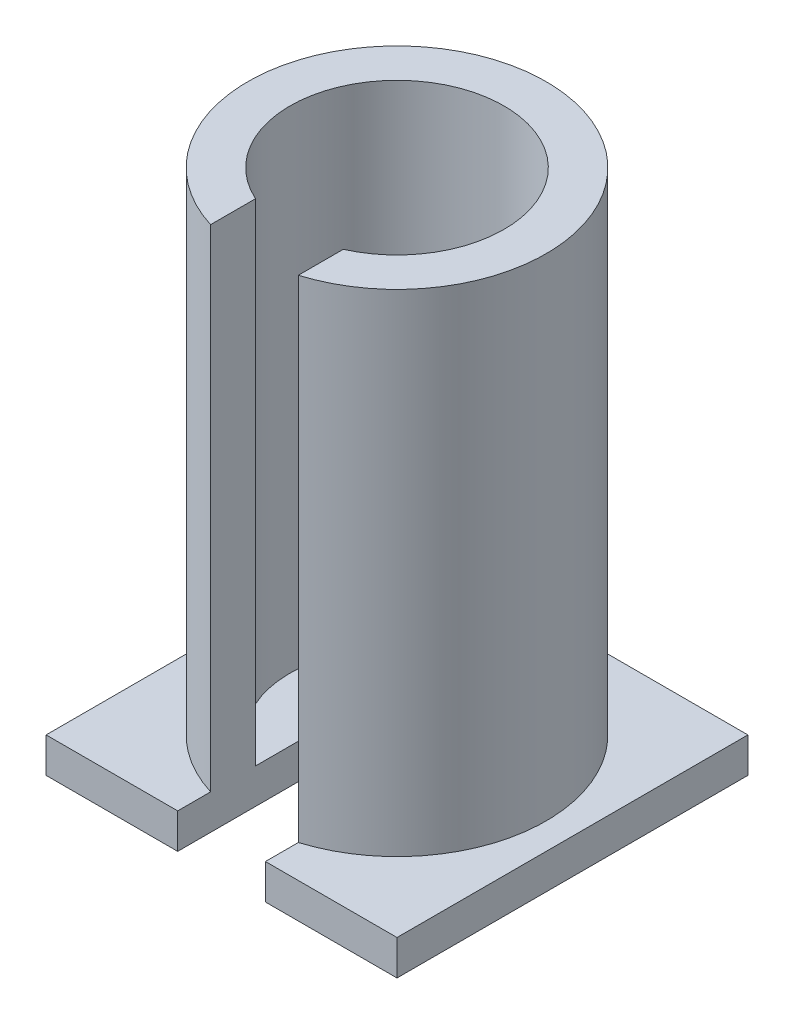
ISO-10303-21;
HEADER;
FILE_DESCRIPTION(('STEP AP214'),'2;1');
FILE_NAME('part.step','',(''),(''),'','','');
FILE_SCHEMA(('AUTOMOTIVE_DESIGN { 1 0 10303 214 1 1 1 1 }'));
ENDSEC;
DATA;
#1=APPLICATION_CONTEXT('core data for automotive mechanical design processes');
#2=APPLICATION_PROTOCOL_DEFINITION('international standard','automotive_design',2000,#1);
#3=PRODUCT_CONTEXT('',#1,'mechanical');
#4=PRODUCT('Part','Part','',(#3));
#5=PRODUCT_RELATED_PRODUCT_CATEGORY('part','',(#4));
#6=PRODUCT_DEFINITION_FORMATION('','',#4);
#7=PRODUCT_DEFINITION_CONTEXT('part definition',#1,'design');
#8=PRODUCT_DEFINITION('design','',#6,#7);
#9=PRODUCT_DEFINITION_SHAPE('','',#8);
#10=(LENGTH_UNIT() NAMED_UNIT(*) SI_UNIT(.MILLI.,.METRE.));
#11=(NAMED_UNIT(*) PLANE_ANGLE_UNIT() SI_UNIT($,.RADIAN.));
#12=(NAMED_UNIT(*) SI_UNIT($,.STERADIAN.) SOLID_ANGLE_UNIT());
#13=UNCERTAINTY_MEASURE_WITH_UNIT(LENGTH_MEASURE(1.E-05),#10,'distance_accuracy_value','');
#14=(GEOMETRIC_REPRESENTATION_CONTEXT(3) GLOBAL_UNCERTAINTY_ASSIGNED_CONTEXT((#13)) GLOBAL_UNIT_ASSIGNED_CONTEXT((#10,
#11,#12)) REPRESENTATION_CONTEXT('',''));
#15=CARTESIAN_POINT('',(0.,0.,0.));
#16=DIRECTION('',(0.,0.,1.));
#17=DIRECTION('',(1.,0.,0.));
#18=AXIS2_PLACEMENT_3D('',#15,#16,#17);
#19=CARTESIAN_POINT('',(0.,15.,0.));
#20=DIRECTION('',(0.,-1.,0.));
#21=DIRECTION('',(0.,0.,-1.));
#22=AXIS2_PLACEMENT_3D('',#19,#20,#21);
#23=CYLINDRICAL_SURFACE('',#22,4.25);
#24=DIRECTION('',(0.,-1.,0.));
#25=VECTOR('',#24,1.);
#26=CARTESIAN_POINT('',(1.25,15.,4.06201920231798));
#27=LINE('',#26,#25);
#28=CARTESIAN_POINT('',(1.25,15.,4.06201920231798));
#29=VERTEX_POINT('',#28);
#30=CARTESIAN_POINT('',(1.25,1.,4.06201920231798));
#31=VERTEX_POINT('',#30);
#32=EDGE_CURVE('E54',#29,#31,#27,.T.);
#33=ORIENTED_EDGE('',*,*,#32,.T.);
#34=CARTESIAN_POINT('',(0.,1.,0.));
#35=DIRECTION('',(0.,1.,0.));
#36=DIRECTION('',(0.,0.,1.));
#37=AXIS2_PLACEMENT_3D('',#34,#35,#36);
#38=CIRCLE('',#37,4.25);
#39=CARTESIAN_POINT('',(-1.25,1.,4.06201920231798));
#40=VERTEX_POINT('',#39);
#41=EDGE_CURVE('E58',#31,#40,#38,.T.);
#42=ORIENTED_EDGE('',*,*,#41,.T.);
#43=DIRECTION('',(0.,-1.,0.));
#44=VECTOR('',#43,1.);
#45=CARTESIAN_POINT('',(-1.25,15.,4.06201920231798));
#46=LINE('',#45,#44);
#47=CARTESIAN_POINT('',(-1.25,15.,4.06201920231798));
#48=VERTEX_POINT('',#47);
#49=EDGE_CURVE('E234',#48,#40,#46,.T.);
#50=ORIENTED_EDGE('',*,*,#49,.F.);
#51=CARTESIAN_POINT('',(0.,15.,0.));
#52=DIRECTION('',(0.,1.,0.));
#53=DIRECTION('',(0.,0.,1.));
#54=AXIS2_PLACEMENT_3D('',#51,#52,#53);
#55=CIRCLE('',#54,4.25);
#56=EDGE_CURVE('E242',#29,#48,#55,.T.);
#57=ORIENTED_EDGE('',*,*,#56,.F.);
#58=EDGE_LOOP('',(#33,#42,#50,#57));
#59=FACE_BOUND('',#58,.T.);
#60=ADVANCED_FACE('F39',(#59),#23,.T.);
#61=CARTESIAN_POINT('',(0.,15.,0.));
#62=DIRECTION('',(0.,-1.,0.));
#63=DIRECTION('',(0.,0.,-1.));
#64=AXIS2_PLACEMENT_3D('',#61,#62,#63);
#65=CYLINDRICAL_SURFACE('',#64,3.05);
#66=CARTESIAN_POINT('',(0.,15.,0.));
#67=DIRECTION('',(0.,1.,0.));
#68=DIRECTION('',(0.,0.,1.));
#69=AXIS2_PLACEMENT_3D('',#66,#67,#68);
#70=CIRCLE('',#69,3.05);
#71=CARTESIAN_POINT('',(1.25,15.,2.78208554864871));
#72=VERTEX_POINT('',#71);
#73=CARTESIAN_POINT('',(-1.25,15.,2.78208554864871));
#74=VERTEX_POINT('',#73);
#75=EDGE_CURVE('E249',#72,#74,#70,.T.);
#76=ORIENTED_EDGE('',*,*,#75,.T.);
#77=DIRECTION('',(0.,-1.,0.));
#78=VECTOR('',#77,1.);
#79=CARTESIAN_POINT('',(-1.25,15.,2.78208554864871));
#80=LINE('',#79,#78);
#81=CARTESIAN_POINT('',(-1.25,1.,2.78208554864871));
#82=VERTEX_POINT('',#81);
#83=EDGE_CURVE('E230',#74,#82,#80,.T.);
#84=ORIENTED_EDGE('',*,*,#83,.T.);
#85=CARTESIAN_POINT('',(0.,1.,0.));
#86=DIRECTION('',(0.,1.,0.));
#87=DIRECTION('',(0.,0.,1.));
#88=AXIS2_PLACEMENT_3D('',#85,#86,#87);
#89=CIRCLE('',#88,3.05);
#90=CARTESIAN_POINT('',(1.25,1.,2.78208554864871));
#91=VERTEX_POINT('',#90);
#92=EDGE_CURVE('E253',#91,#82,#89,.T.);
#93=ORIENTED_EDGE('',*,*,#92,.F.);
#94=DIRECTION('',(0.,-1.,0.));
#95=VECTOR('',#94,1.);
#96=CARTESIAN_POINT('',(1.25,15.,2.78208554864871));
#97=LINE('',#96,#95);
#98=EDGE_CURVE('E221',#72,#91,#97,.T.);
#99=ORIENTED_EDGE('',*,*,#98,.F.);
#100=EDGE_LOOP('',(#76,#84,#93,#99));
#101=FACE_BOUND('',#100,.T.);
#102=ADVANCED_FACE('F273',(#101),#65,.F.);
#103=CARTESIAN_POINT('',(0.,15.,0.));
#104=DIRECTION('',(0.,1.,0.));
#105=DIRECTION('',(0.,0.,1.));
#106=AXIS2_PLACEMENT_3D('',#103,#104,#105);
#107=PLANE('',#106);
#108=ORIENTED_EDGE('',*,*,#56,.T.);
#109=DIRECTION('',(0.,0.,1.));
#110=VECTOR('',#109,1.);
#111=CARTESIAN_POINT('',(-1.25,15.,0.));
#112=LINE('',#111,#110);
#113=EDGE_CURVE('E207',#74,#48,#112,.T.);
#114=ORIENTED_EDGE('',*,*,#113,.F.);
#115=ORIENTED_EDGE('',*,*,#75,.F.);
#116=DIRECTION('',(0.,0.,1.));
#117=VECTOR('',#116,1.);
#118=CARTESIAN_POINT('',(1.25,15.,0.));
#119=LINE('',#118,#117);
#120=EDGE_CURVE('E210',#72,#29,#119,.T.);
#121=ORIENTED_EDGE('',*,*,#120,.T.);
#122=EDGE_LOOP('',(#108,#114,#115,#121));
#123=FACE_BOUND('',#122,.T.);
#124=ADVANCED_FACE('F277',(#123),#107,.T.);
#125=CARTESIAN_POINT('',(0.,0.,0.));
#126=DIRECTION('',(0.,1.,0.));
#127=DIRECTION('',(0.,0.,1.));
#128=AXIS2_PLACEMENT_3D('',#125,#126,#127);
#129=PLANE('',#128);
#130=DIRECTION('',(0.,0.,1.));
#131=VECTOR('',#130,1.);
#132=CARTESIAN_POINT('',(-1.25,0.,0.));
#133=LINE('',#132,#131);
#134=CARTESIAN_POINT('',(-1.25,0.,0.));
#135=VERTEX_POINT('',#134);
#136=CARTESIAN_POINT('',(-1.25,0.,5.));
#137=VERTEX_POINT('',#136);
#138=EDGE_CURVE('E206',#135,#137,#133,.T.);
#139=ORIENTED_EDGE('',*,*,#138,.T.);
#140=DIRECTION('',(-1.,0.,0.));
#141=VECTOR('',#140,1.);
#142=CARTESIAN_POINT('',(0.,0.,5.));
#143=LINE('',#142,#141);
#144=CARTESIAN_POINT('',(-5.,0.,5.));
#145=VERTEX_POINT('',#144);
#146=EDGE_CURVE('E135',#137,#145,#143,.T.);
#147=ORIENTED_EDGE('',*,*,#146,.T.);
#148=DIRECTION('',(0.,0.,-1.));
#149=VECTOR('',#148,1.);
#150=CARTESIAN_POINT('',(-5.,0.,0.));
#151=LINE('',#150,#149);
#152=CARTESIAN_POINT('',(-5.,0.,-5.));
#153=VERTEX_POINT('',#152);
#154=EDGE_CURVE('E185',#145,#153,#151,.T.);
#155=ORIENTED_EDGE('',*,*,#154,.T.);
#156=DIRECTION('',(-1.,0.,0.));
#157=VECTOR('',#156,1.);
#158=CARTESIAN_POINT('',(0.,0.,-5.));
#159=LINE('',#158,#157);
#160=CARTESIAN_POINT('',(5.,0.,-5.));
#161=VERTEX_POINT('',#160);
#162=EDGE_CURVE('E181',#161,#153,#159,.T.);
#163=ORIENTED_EDGE('',*,*,#162,.F.);
#164=DIRECTION('',(0.,0.,-1.));
#165=VECTOR('',#164,1.);
#166=CARTESIAN_POINT('',(5.,0.,0.));
#167=LINE('',#166,#165);
#168=CARTESIAN_POINT('',(5.,0.,5.));
#169=VERTEX_POINT('',#168);
#170=EDGE_CURVE('E178',#169,#161,#167,.T.);
#171=ORIENTED_EDGE('',*,*,#170,.F.);
#172=CARTESIAN_POINT('',(1.25,0.,5.));
#173=VERTEX_POINT('',#172);
#174=EDGE_CURVE('E175',#169,#173,#143,.T.);
#175=ORIENTED_EDGE('',*,*,#174,.T.);
#176=DIRECTION('',(0.,0.,1.));
#177=VECTOR('',#176,1.);
#178=CARTESIAN_POINT('',(1.25,0.,0.));
#179=LINE('',#178,#177);
#180=CARTESIAN_POINT('',(1.25,0.,0.));
#181=VERTEX_POINT('',#180);
#182=EDGE_CURVE('E141',#181,#173,#179,.T.);
#183=ORIENTED_EDGE('',*,*,#182,.F.);
#184=CARTESIAN_POINT('',(0.,0.,0.));
#185=DIRECTION('',(0.,1.,0.));
#186=DIRECTION('',(0.,0.,1.));
#187=AXIS2_PLACEMENT_3D('',#184,#185,#186);
#188=CIRCLE('',#187,1.25);
#189=EDGE_CURVE('E237',#181,#135,#188,.T.);
#190=ORIENTED_EDGE('',*,*,#189,.T.);
#191=EDGE_LOOP('',(#139,#147,#155,#163,#171,#175,#183,#190));
#192=FACE_BOUND('',#191,.T.);
#193=ADVANCED_FACE('F263',(#192),#129,.F.);
#194=CARTESIAN_POINT('',(0.,1.,0.));
#195=DIRECTION('',(0.,1.,0.));
#196=DIRECTION('',(0.,0.,1.));
#197=AXIS2_PLACEMENT_3D('',#194,#195,#196);
#198=PLANE('',#197);
#199=ORIENTED_EDGE('',*,*,#92,.T.);
#200=DIRECTION('',(0.,0.,-1.));
#201=VECTOR('',#200,1.);
#202=CARTESIAN_POINT('',(-1.25,1.,0.));
#203=LINE('',#202,#201);
#204=CARTESIAN_POINT('',(-1.25,1.,0.));
#205=VERTEX_POINT('',#204);
#206=EDGE_CURVE('E226',#82,#205,#203,.T.);
#207=ORIENTED_EDGE('',*,*,#206,.T.);
#208=CARTESIAN_POINT('',(0.,1.,0.));
#209=DIRECTION('',(0.,1.,0.));
#210=DIRECTION('',(0.,0.,1.));
#211=AXIS2_PLACEMENT_3D('',#208,#209,#210);
#212=CIRCLE('',#211,1.25);
#213=CARTESIAN_POINT('',(1.25,1.,0.));
#214=VERTEX_POINT('',#213);
#215=EDGE_CURVE('E238',#214,#205,#212,.T.);
#216=ORIENTED_EDGE('',*,*,#215,.F.);
#217=DIRECTION('',(0.,0.,-1.));
#218=VECTOR('',#217,1.);
#219=CARTESIAN_POINT('',(1.25,1.,0.));
#220=LINE('',#219,#218);
#221=EDGE_CURVE('E214',#91,#214,#220,.T.);
#222=ORIENTED_EDGE('',*,*,#221,.F.);
#223=EDGE_LOOP('',(#199,#207,#216,#222));
#224=FACE_BOUND('',#223,.T.);
#225=ADVANCED_FACE('F269',(#224),#198,.T.);
#226=CARTESIAN_POINT('',(0.,1.,0.));
#227=DIRECTION('',(0.,-1.,0.));
#228=DIRECTION('',(0.,0.,-1.));
#229=AXIS2_PLACEMENT_3D('',#226,#227,#228);
#230=CYLINDRICAL_SURFACE('',#229,1.25);
#231=ORIENTED_EDGE('',*,*,#215,.T.);
#232=DIRECTION('',(0.,-1.,0.));
#233=VECTOR('',#232,1.);
#234=CARTESIAN_POINT('',(-1.25,1.,0.));
#235=LINE('',#234,#233);
#236=EDGE_CURVE('E11',#205,#135,#235,.T.);
#237=ORIENTED_EDGE('',*,*,#236,.T.);
#238=ORIENTED_EDGE('',*,*,#189,.F.);
#239=DIRECTION('',(0.,-1.,0.));
#240=VECTOR('',#239,1.);
#241=CARTESIAN_POINT('',(1.25,1.,0.));
#242=LINE('',#241,#240);
#243=EDGE_CURVE('E47',#214,#181,#242,.T.);
#244=ORIENTED_EDGE('',*,*,#243,.F.);
#245=EDGE_LOOP('',(#231,#237,#238,#244));
#246=FACE_BOUND('',#245,.T.);
#247=ADVANCED_FACE('F265',(#246),#230,.F.);
#248=CARTESIAN_POINT('',(1.25,15.,0.));
#249=DIRECTION('',(1.,0.,0.));
#250=DIRECTION('',(0.,0.,-1.));
#251=AXIS2_PLACEMENT_3D('',#248,#249,#250);
#252=PLANE('',#251);
#253=ORIENTED_EDGE('',*,*,#98,.T.);
#254=ORIENTED_EDGE('',*,*,#221,.T.);
#255=ORIENTED_EDGE('',*,*,#243,.T.);
#256=ORIENTED_EDGE('',*,*,#182,.T.);
#257=DIRECTION('',(0.,-1.,0.));
#258=VECTOR('',#257,1.);
#259=CARTESIAN_POINT('',(1.25,1.,5.));
#260=LINE('',#259,#258);
#261=CARTESIAN_POINT('',(1.25,1.,5.));
#262=VERTEX_POINT('',#261);
#263=EDGE_CURVE('E138',#262,#173,#260,.T.);
#264=ORIENTED_EDGE('',*,*,#263,.F.);
#265=DIRECTION('',(0.,0.,1.));
#266=VECTOR('',#265,1.);
#267=CARTESIAN_POINT('',(1.25,1.,0.));
#268=LINE('',#267,#266);
#269=EDGE_CURVE('E127',#31,#262,#268,.T.);
#270=ORIENTED_EDGE('',*,*,#269,.F.);
#271=ORIENTED_EDGE('',*,*,#32,.F.);
#272=ORIENTED_EDGE('',*,*,#120,.F.);
#273=EDGE_LOOP('',(#253,#254,#255,#256,#264,#270,#271,#272));
#274=FACE_BOUND('',#273,.T.);
#275=ADVANCED_FACE('F139',(#274),#252,.F.);
#276=CARTESIAN_POINT('',(-1.25,15.,0.));
#277=DIRECTION('',(1.,0.,0.));
#278=DIRECTION('',(0.,0.,-1.));
#279=AXIS2_PLACEMENT_3D('',#276,#277,#278);
#280=PLANE('',#279);
#281=ORIENTED_EDGE('',*,*,#49,.T.);
#282=DIRECTION('',(0.,0.,1.));
#283=VECTOR('',#282,1.);
#284=CARTESIAN_POINT('',(-1.25,1.,0.));
#285=LINE('',#284,#283);
#286=CARTESIAN_POINT('',(-1.25,1.,5.));
#287=VERTEX_POINT('',#286);
#288=EDGE_CURVE('E159',#40,#287,#285,.T.);
#289=ORIENTED_EDGE('',*,*,#288,.T.);
#290=DIRECTION('',(0.,-1.,0.));
#291=VECTOR('',#290,1.);
#292=CARTESIAN_POINT('',(-1.25,1.,5.));
#293=LINE('',#292,#291);
#294=EDGE_CURVE('E166',#287,#137,#293,.T.);
#295=ORIENTED_EDGE('',*,*,#294,.T.);
#296=ORIENTED_EDGE('',*,*,#138,.F.);
#297=ORIENTED_EDGE('',*,*,#236,.F.);
#298=ORIENTED_EDGE('',*,*,#206,.F.);
#299=ORIENTED_EDGE('',*,*,#83,.F.);
#300=ORIENTED_EDGE('',*,*,#113,.T.);
#301=EDGE_LOOP('',(#281,#289,#295,#296,#297,#298,#299,#300));
#302=FACE_BOUND('',#301,.T.);
#303=ADVANCED_FACE('F267',(#302),#280,.T.);
#304=CARTESIAN_POINT('',(0.,1.,0.));
#305=DIRECTION('',(0.,1.,0.));
#306=DIRECTION('',(0.,0.,1.));
#307=AXIS2_PLACEMENT_3D('',#304,#305,#306);
#308=PLANE('',#307);
#309=ORIENTED_EDGE('',*,*,#41,.F.);
#310=ORIENTED_EDGE('',*,*,#269,.T.);
#311=DIRECTION('',(-1.,0.,0.));
#312=VECTOR('',#311,1.);
#313=CARTESIAN_POINT('',(0.,1.,5.));
#314=LINE('',#313,#312);
#315=CARTESIAN_POINT('',(5.,1.,5.));
#316=VERTEX_POINT('',#315);
#317=EDGE_CURVE('E131',#316,#262,#314,.T.);
#318=ORIENTED_EDGE('',*,*,#317,.F.);
#319=DIRECTION('',(0.,0.,-1.));
#320=VECTOR('',#319,1.);
#321=CARTESIAN_POINT('',(5.,1.,0.));
#322=LINE('',#321,#320);
#323=CARTESIAN_POINT('',(5.,1.,-5.));
#324=VERTEX_POINT('',#323);
#325=EDGE_CURVE('E151',#316,#324,#322,.T.);
#326=ORIENTED_EDGE('',*,*,#325,.T.);
#327=DIRECTION('',(-1.,0.,0.));
#328=VECTOR('',#327,1.);
#329=CARTESIAN_POINT('',(0.,1.,-5.));
#330=LINE('',#329,#328);
#331=CARTESIAN_POINT('',(-5.,1.,-5.));
#332=VERTEX_POINT('',#331);
#333=EDGE_CURVE('E155',#324,#332,#330,.T.);
#334=ORIENTED_EDGE('',*,*,#333,.T.);
#335=DIRECTION('',(0.,0.,-1.));
#336=VECTOR('',#335,1.);
#337=CARTESIAN_POINT('',(-5.,1.,0.));
#338=LINE('',#337,#336);
#339=CARTESIAN_POINT('',(-5.,1.,5.));
#340=VERTEX_POINT('',#339);
#341=EDGE_CURVE('E160',#340,#332,#338,.T.);
#342=ORIENTED_EDGE('',*,*,#341,.F.);
#343=EDGE_CURVE('E153',#287,#340,#314,.T.);
#344=ORIENTED_EDGE('',*,*,#343,.F.);
#345=ORIENTED_EDGE('',*,*,#288,.F.);
#346=EDGE_LOOP('',(#309,#310,#318,#326,#334,#342,#344,#345));
#347=FACE_BOUND('',#346,.T.);
#348=ADVANCED_FACE('F129',(#347),#308,.T.);
#349=CARTESIAN_POINT('',(0.,1.,5.));
#350=DIRECTION('',(0.,0.,1.));
#351=DIRECTION('',(1.,0.,0.));
#352=AXIS2_PLACEMENT_3D('',#349,#350,#351);
#353=PLANE('',#352);
#354=ORIENTED_EDGE('',*,*,#174,.F.);
#355=DIRECTION('',(0.,-1.,0.));
#356=VECTOR('',#355,1.);
#357=CARTESIAN_POINT('',(5.,1.,5.));
#358=LINE('',#357,#356);
#359=EDGE_CURVE('E146',#316,#169,#358,.T.);
#360=ORIENTED_EDGE('',*,*,#359,.F.);
#361=ORIENTED_EDGE('',*,*,#317,.T.);
#362=ORIENTED_EDGE('',*,*,#263,.T.);
#363=EDGE_LOOP('',(#354,#360,#361,#362));
#364=FACE_BOUND('',#363,.T.);
#365=ADVANCED_FACE('F148',(#364),#353,.T.);
#366=CARTESIAN_POINT('',(5.,1.,0.));
#367=DIRECTION('',(-1.,0.,0.));
#368=DIRECTION('',(0.,0.,1.));
#369=AXIS2_PLACEMENT_3D('',#366,#367,#368);
#370=PLANE('',#369);
#371=ORIENTED_EDGE('',*,*,#170,.T.);
#372=DIRECTION('',(0.,-1.,0.));
#373=VECTOR('',#372,1.);
#374=CARTESIAN_POINT('',(5.,1.,-5.));
#375=LINE('',#374,#373);
#376=EDGE_CURVE('E198',#324,#161,#375,.T.);
#377=ORIENTED_EDGE('',*,*,#376,.F.);
#378=ORIENTED_EDGE('',*,*,#325,.F.);
#379=ORIENTED_EDGE('',*,*,#359,.T.);
#380=EDGE_LOOP('',(#371,#377,#378,#379));
#381=FACE_BOUND('',#380,.T.);
#382=ADVANCED_FACE('F298',(#381),#370,.F.);
#383=CARTESIAN_POINT('',(0.,1.,-5.));
#384=DIRECTION('',(0.,0.,1.));
#385=DIRECTION('',(1.,0.,0.));
#386=AXIS2_PLACEMENT_3D('',#383,#384,#385);
#387=PLANE('',#386);
#388=ORIENTED_EDGE('',*,*,#162,.T.);
#389=DIRECTION('',(0.,-1.,0.));
#390=VECTOR('',#389,1.);
#391=CARTESIAN_POINT('',(-5.,1.,-5.));
#392=LINE('',#391,#390);
#393=EDGE_CURVE('E195',#332,#153,#392,.T.);
#394=ORIENTED_EDGE('',*,*,#393,.F.);
#395=ORIENTED_EDGE('',*,*,#333,.F.);
#396=ORIENTED_EDGE('',*,*,#376,.T.);
#397=EDGE_LOOP('',(#388,#394,#395,#396));
#398=FACE_BOUND('',#397,.T.);
#399=ADVANCED_FACE('F282',(#398),#387,.F.);
#400=CARTESIAN_POINT('',(-5.,1.,0.));
#401=DIRECTION('',(-1.,0.,0.));
#402=DIRECTION('',(0.,0.,1.));
#403=AXIS2_PLACEMENT_3D('',#400,#401,#402);
#404=PLANE('',#403);
#405=ORIENTED_EDGE('',*,*,#154,.F.);
#406=DIRECTION('',(0.,-1.,0.));
#407=VECTOR('',#406,1.);
#408=CARTESIAN_POINT('',(-5.,1.,5.));
#409=LINE('',#408,#407);
#410=EDGE_CURVE('E192',#340,#145,#409,.T.);
#411=ORIENTED_EDGE('',*,*,#410,.F.);
#412=ORIENTED_EDGE('',*,*,#341,.T.);
#413=ORIENTED_EDGE('',*,*,#393,.T.);
#414=EDGE_LOOP('',(#405,#411,#412,#413));
#415=FACE_BOUND('',#414,.T.);
#416=ADVANCED_FACE('F285',(#415),#404,.T.);
#417=ORIENTED_EDGE('',*,*,#146,.F.);
#418=ORIENTED_EDGE('',*,*,#294,.F.);
#419=ORIENTED_EDGE('',*,*,#343,.T.);
#420=ORIENTED_EDGE('',*,*,#410,.T.);
#421=EDGE_LOOP('',(#417,#418,#419,#420));
#422=FACE_BOUND('',#421,.T.);
#423=ADVANCED_FACE('F289',(#422),#353,.T.);
#424=CLOSED_SHELL('',(#60,#102,#124,#193,#225,#247,#275,#303,#348,#365,#382,#399,#416,#423));
#425=MANIFOLD_SOLID_BREP('B2',#424);
#426=ADVANCED_BREP_SHAPE_REPRESENTATION('',(#18,#425),#14);
#427=SHAPE_DEFINITION_REPRESENTATION(#9,#426);
ENDSEC;
END-ISO-10303-21;
